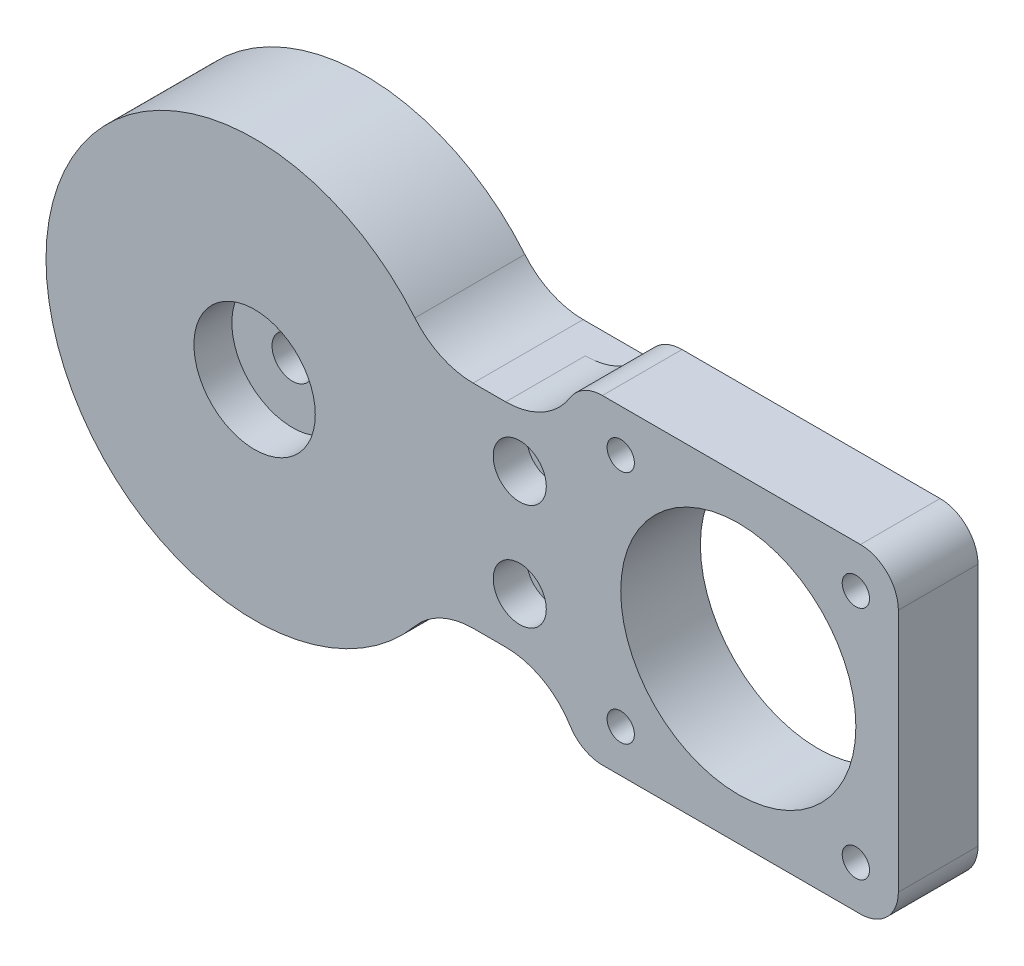
ISO-10303-21;
HEADER;
FILE_DESCRIPTION(('STEP AP214'),'2;1');
FILE_NAME('part.step','',(''),(''),'','','');
FILE_SCHEMA(('AUTOMOTIVE_DESIGN { 1 0 10303 214 1 1 1 1 }'));
ENDSEC;
DATA;
#1=APPLICATION_CONTEXT('core data for automotive mechanical design processes');
#2=APPLICATION_PROTOCOL_DEFINITION('international standard','automotive_design',2000,#1);
#3=PRODUCT_CONTEXT('',#1,'mechanical');
#4=PRODUCT('Part','Part','',(#3));
#5=PRODUCT_RELATED_PRODUCT_CATEGORY('part','',(#4));
#6=PRODUCT_DEFINITION_FORMATION('','',#4);
#7=PRODUCT_DEFINITION_CONTEXT('part definition',#1,'design');
#8=PRODUCT_DEFINITION('design','',#6,#7);
#9=PRODUCT_DEFINITION_SHAPE('','',#8);
#10=(LENGTH_UNIT() NAMED_UNIT(*) SI_UNIT(.MILLI.,.METRE.));
#11=(NAMED_UNIT(*) PLANE_ANGLE_UNIT() SI_UNIT($,.RADIAN.));
#12=(NAMED_UNIT(*) SI_UNIT($,.STERADIAN.) SOLID_ANGLE_UNIT());
#13=UNCERTAINTY_MEASURE_WITH_UNIT(LENGTH_MEASURE(1.E-05),#10,'distance_accuracy_value','');
#14=(GEOMETRIC_REPRESENTATION_CONTEXT(3) GLOBAL_UNCERTAINTY_ASSIGNED_CONTEXT((#13)) GLOBAL_UNIT_ASSIGNED_CONTEXT((#10,
#11,#12)) REPRESENTATION_CONTEXT('',''));
#15=CARTESIAN_POINT('',(0.,0.,0.));
#16=DIRECTION('',(0.,0.,1.));
#17=DIRECTION('',(1.,0.,0.));
#18=AXIS2_PLACEMENT_3D('',#15,#16,#17);
#19=CARTESIAN_POINT('',(0.,0.,14.5));
#20=DIRECTION('',(0.,0.,-1.));
#21=DIRECTION('',(-1.,0.,0.));
#22=AXIS2_PLACEMENT_3D('',#19,#20,#21);
#23=CYLINDRICAL_SURFACE('',#22,2.7);
#24=CARTESIAN_POINT('',(0.,0.,0.));
#25=DIRECTION('',(0.,0.,1.));
#26=DIRECTION('',(1.,0.,0.));
#27=AXIS2_PLACEMENT_3D('',#24,#25,#26);
#28=CIRCLE('',#27,2.7);
#29=CARTESIAN_POINT('',(-2.7,0.,0.));
#30=VERTEX_POINT('',#29);
#31=EDGE_CURVE('E197',#30,#30,#28,.T.);
#32=CARTESIAN_POINT('',(0.,0.,9.5));
#33=DIRECTION('',(0.,0.,1.));
#34=DIRECTION('',(1.,0.,0.));
#35=AXIS2_PLACEMENT_3D('',#32,#33,#34);
#36=CIRCLE('',#35,2.7);
#37=CARTESIAN_POINT('',(-2.7,0.,9.5));
#38=VERTEX_POINT('',#37);
#39=EDGE_CURVE('E182',#38,#38,#36,.T.);
#40=CARTESIAN_POINT('',(-2.7,0.,0.));
#41=CARTESIAN_POINT('',(-2.7,0.,0.0989583333333334));
#42=CARTESIAN_POINT('',(-2.7,0.,0.197916666666667));
#43=CARTESIAN_POINT('',(-2.7,0.,0.395833333333334));
#44=CARTESIAN_POINT('',(-2.7,0.,0.494791666666667));
#45=CARTESIAN_POINT('',(-2.7,0.,0.692708333333334));
#46=CARTESIAN_POINT('',(-2.7,0.,0.791666666666667));
#47=CARTESIAN_POINT('',(-2.7,0.,0.989583333333334));
#48=CARTESIAN_POINT('',(-2.7,0.,1.08854166666667));
#49=CARTESIAN_POINT('',(-2.7,0.,1.28645833333333));
#50=CARTESIAN_POINT('',(-2.7,0.,1.38541666666667));
#51=CARTESIAN_POINT('',(-2.7,0.,1.58333333333333));
#52=CARTESIAN_POINT('',(-2.7,0.,1.68229166666667));
#53=CARTESIAN_POINT('',(-2.7,0.,1.88020833333333));
#54=CARTESIAN_POINT('',(-2.7,0.,1.97916666666667));
#55=CARTESIAN_POINT('',(-2.7,0.,2.17708333333333));
#56=CARTESIAN_POINT('',(-2.7,0.,2.27604166666667));
#57=CARTESIAN_POINT('',(-2.7,0.,2.47395833333333));
#58=CARTESIAN_POINT('',(-2.7,0.,2.57291666666667));
#59=CARTESIAN_POINT('',(-2.7,0.,2.77083333333333));
#60=CARTESIAN_POINT('',(-2.7,0.,2.86979166666667));
#61=CARTESIAN_POINT('',(-2.7,0.,3.06770833333333));
#62=CARTESIAN_POINT('',(-2.7,0.,3.16666666666667));
#63=CARTESIAN_POINT('',(-2.7,0.,3.36458333333333));
#64=CARTESIAN_POINT('',(-2.7,0.,3.46354166666667));
#65=CARTESIAN_POINT('',(-2.7,0.,3.66145833333333));
#66=CARTESIAN_POINT('',(-2.7,0.,3.76041666666667));
#67=CARTESIAN_POINT('',(-2.7,0.,3.95833333333333));
#68=CARTESIAN_POINT('',(-2.7,0.,4.05729166666667));
#69=CARTESIAN_POINT('',(-2.7,0.,4.25520833333333));
#70=CARTESIAN_POINT('',(-2.7,0.,4.35416666666667));
#71=CARTESIAN_POINT('',(-2.7,0.,4.55208333333333));
#72=CARTESIAN_POINT('',(-2.7,0.,4.65104166666667));
#73=CARTESIAN_POINT('',(-2.7,0.,4.84895833333333));
#74=CARTESIAN_POINT('',(-2.7,0.,4.94791666666667));
#75=CARTESIAN_POINT('',(-2.7,0.,5.14583333333333));
#76=CARTESIAN_POINT('',(-2.7,0.,5.24479166666667));
#77=CARTESIAN_POINT('',(-2.7,0.,5.44270833333333));
#78=CARTESIAN_POINT('',(-2.7,0.,5.54166666666667));
#79=CARTESIAN_POINT('',(-2.7,0.,5.73958333333333));
#80=CARTESIAN_POINT('',(-2.7,0.,5.83854166666667));
#81=CARTESIAN_POINT('',(-2.7,0.,6.03645833333333));
#82=CARTESIAN_POINT('',(-2.7,0.,6.13541666666667));
#83=CARTESIAN_POINT('',(-2.7,0.,6.33333333333333));
#84=CARTESIAN_POINT('',(-2.7,0.,6.43229166666667));
#85=CARTESIAN_POINT('',(-2.7,0.,6.63020833333333));
#86=CARTESIAN_POINT('',(-2.7,0.,6.72916666666667));
#87=CARTESIAN_POINT('',(-2.7,0.,6.92708333333333));
#88=CARTESIAN_POINT('',(-2.7,0.,7.02604166666667));
#89=CARTESIAN_POINT('',(-2.7,0.,7.22395833333333));
#90=CARTESIAN_POINT('',(-2.7,0.,7.32291666666667));
#91=CARTESIAN_POINT('',(-2.7,0.,7.52083333333333));
#92=CARTESIAN_POINT('',(-2.7,0.,7.61979166666667));
#93=CARTESIAN_POINT('',(-2.7,0.,7.81770833333333));
#94=CARTESIAN_POINT('',(-2.7,0.,7.91666666666667));
#95=CARTESIAN_POINT('',(-2.7,0.,8.11458333333333));
#96=CARTESIAN_POINT('',(-2.7,0.,8.21354166666667));
#97=CARTESIAN_POINT('',(-2.7,0.,8.41145833333333));
#98=CARTESIAN_POINT('',(-2.7,0.,8.51041666666667));
#99=CARTESIAN_POINT('',(-2.7,0.,8.70833333333333));
#100=CARTESIAN_POINT('',(-2.7,0.,8.80729166666667));
#101=CARTESIAN_POINT('',(-2.7,0.,9.00520833333333));
#102=CARTESIAN_POINT('',(-2.7,0.,9.10416666666667));
#103=CARTESIAN_POINT('',(-2.7,0.,9.30208333333333));
#104=CARTESIAN_POINT('',(-2.7,0.,9.40104166666667));
#105=CARTESIAN_POINT('',(-2.7,0.,9.5));
#106=B_SPLINE_CURVE_WITH_KNOTS('',3,(#40,#41,#42,#43,#44,#45,#46,#47,#48,#49,#50,#51,#52,#53,
#54,#55,#56,#57,#58,#59,#60,#61,#62,#63,#64,#65,#66,#67,#68,#69,#70,#71,#72,#73,#74,#75,#76,#77,
#78,#79,#80,#81,#82,#83,#84,#85,#86,#87,#88,#89,#90,#91,#92,#93,#94,#95,#96,#97,#98,#99,#100,
#101,#102,#103,#104,#105),.UNSPECIFIED.,.F.,.F.,(4,2,2,2,2,2,2,2,2,2,2,2,2,2,2,2,2,2,2,2,2,2,2,
2,2,2,2,2,2,2,2,2,4),(0.,0.296875,0.593750000000001,0.890625000000001,1.1875,1.484375,1.78125,
2.078125,2.375,2.671875,2.96875,3.265625,3.5625,3.859375,4.15625,4.453125,4.75,5.046875,5.34375,
5.640625,5.9375,6.234375,6.53125,6.828125,7.125,7.421875,7.71875,8.015625,8.3125,8.609375,
8.90625,9.203125,9.5),.UNSPECIFIED.);
#107=EDGE_CURVE('BSEAM37',#30,#38,#106,.T.);
#108=ORIENTED_EDGE('',*,*,#31,.F.);
#109=ORIENTED_EDGE('',*,*,#39,.T.);
#110=ORIENTED_EDGE('',*,*,#107,.T.);
#111=ORIENTED_EDGE('',*,*,#107,.F.);
#112=EDGE_LOOP('',(#108,#110,#109,#111));
#113=FACE_BOUND('',#112,.T.);
#114=ADVANCED_FACE('F37',(#113),#23,.F.);
#115=CARTESIAN_POINT('',(0.,0.,14.5));
#116=DIRECTION('',(0.,0.,1.));
#117=DIRECTION('',(1.,0.,0.));
#118=AXIS2_PLACEMENT_3D('',#115,#116,#117);
#119=PLANE('',#118);
#120=CARTESIAN_POINT('',(34.9566966857832,7.,14.5));
#121=DIRECTION('',(0.,0.,1.));
#122=DIRECTION('',(1.,0.,0.));
#123=AXIS2_PLACEMENT_3D('',#120,#121,#122);
#124=CIRCLE('',#123,3.5);
#125=CARTESIAN_POINT('',(38.4566966857832,7.,14.5));
#126=VERTEX_POINT('',#125);
#127=EDGE_CURVE('E347',#126,#126,#124,.T.);
#128=ORIENTED_EDGE('',*,*,#127,.F.);
#129=EDGE_LOOP('',(#128));
#130=FACE_BOUND('',#129,.T.);
#131=CARTESIAN_POINT('',(34.9566966857832,-7.,14.5));
#132=DIRECTION('',(0.,0.,1.));
#133=DIRECTION('',(1.,0.,0.));
#134=AXIS2_PLACEMENT_3D('',#131,#132,#133);
#135=CIRCLE('',#134,3.5);
#136=CARTESIAN_POINT('',(38.4566966857832,-7.,14.5));
#137=VERTEX_POINT('',#136);
#138=EDGE_CURVE('E335',#137,#137,#135,.T.);
#139=ORIENTED_EDGE('',*,*,#138,.F.);
#140=EDGE_LOOP('',(#139));
#141=FACE_BOUND('',#140,.T.);
#142=CARTESIAN_POINT('',(79.2696007570893,-15.5,14.5));
#143=DIRECTION('',(0.,0.,1.));
#144=DIRECTION('',(1.,0.,0.));
#145=AXIS2_PLACEMENT_3D('',#142,#143,#144);
#146=CIRCLE('',#145,1.8);
#147=CARTESIAN_POINT('',(81.0696007570893,-15.5,14.5));
#148=VERTEX_POINT('',#147);
#149=EDGE_CURVE('E273',#148,#148,#146,.T.);
#150=ORIENTED_EDGE('',*,*,#149,.F.);
#151=EDGE_LOOP('',(#150));
#152=FACE_BOUND('',#151,.T.);
#153=CARTESIAN_POINT('',(79.2696007570893,15.5,14.5));
#154=DIRECTION('',(0.,0.,1.));
#155=DIRECTION('',(1.,0.,0.));
#156=AXIS2_PLACEMENT_3D('',#153,#154,#155);
#157=CIRCLE('',#156,1.8);
#158=CARTESIAN_POINT('',(81.0696007570892,15.5,14.5));
#159=VERTEX_POINT('',#158);
#160=EDGE_CURVE('E269',#159,#159,#157,.T.);
#161=ORIENTED_EDGE('',*,*,#160,.F.);
#162=EDGE_LOOP('',(#161));
#163=FACE_BOUND('',#162,.T.);
#164=CARTESIAN_POINT('',(48.2696007570893,15.5,14.5));
#165=DIRECTION('',(0.,0.,1.));
#166=DIRECTION('',(1.,0.,0.));
#167=AXIS2_PLACEMENT_3D('',#164,#165,#166);
#168=CIRCLE('',#167,1.8);
#169=CARTESIAN_POINT('',(50.0696007570893,15.5,14.5));
#170=VERTEX_POINT('',#169);
#171=EDGE_CURVE('E265',#170,#170,#168,.T.);
#172=ORIENTED_EDGE('',*,*,#171,.F.);
#173=EDGE_LOOP('',(#172));
#174=FACE_BOUND('',#173,.T.);
#175=CARTESIAN_POINT('',(48.2696007570893,-15.5,14.5));
#176=DIRECTION('',(0.,0.,1.));
#177=DIRECTION('',(1.,0.,0.));
#178=AXIS2_PLACEMENT_3D('',#175,#176,#177);
#179=CIRCLE('',#178,1.8);
#180=CARTESIAN_POINT('',(50.0696007570893,-15.5,14.5));
#181=VERTEX_POINT('',#180);
#182=EDGE_CURVE('E261',#181,#181,#179,.T.);
#183=ORIENTED_EDGE('',*,*,#182,.F.);
#184=EDGE_LOOP('',(#183));
#185=FACE_BOUND('',#184,.T.);
#186=CARTESIAN_POINT('',(0.,0.,14.5));
#187=DIRECTION('',(0.,0.,1.));
#188=DIRECTION('',(1.,0.,0.));
#189=AXIS2_PLACEMENT_3D('',#186,#187,#188);
#190=CIRCLE('',#189,8.);
#191=CARTESIAN_POINT('',(8.,0.,14.5));
#192=VERTEX_POINT('',#191);
#193=EDGE_CURVE('E260',#192,#192,#190,.T.);
#194=ORIENTED_EDGE('',*,*,#193,.F.);
#195=EDGE_LOOP('',(#194));
#196=FACE_BOUND('',#195,.T.);
#197=CARTESIAN_POINT('',(33.0993343031184,-24.,14.5));
#198=DIRECTION('',(0.,0.,1.));
#199=DIRECTION('',(1.,0.,0.));
#200=AXIS2_PLACEMENT_3D('',#197,#198,#199);
#201=CIRCLE('',#200,10.);
#202=CARTESIAN_POINT('',(33.0993343031184,-14.,14.5));
#203=VERTEX_POINT('',#202);
#204=CARTESIAN_POINT('',(41.6000532269637,-18.7333333333333,14.5));
#205=VERTEX_POINT('',#204);
#206=EDGE_CURVE('E240',#203,#205,#201,.F.);
#207=ORIENTED_EDGE('',*,*,#206,.T.);
#208=CARTESIAN_POINT('',(45.8504126888864,-16.1,14.5));
#209=DIRECTION('',(0.,0.,1.));
#210=DIRECTION('',(1.,0.,0.));
#211=AXIS2_PLACEMENT_3D('',#208,#209,#210);
#212=CIRCLE('',#211,5.);
#213=CARTESIAN_POINT('',(45.8504126888864,-21.1,14.5));
#214=VERTEX_POINT('',#213);
#215=EDGE_CURVE('E293',#205,#214,#212,.T.);
#216=ORIENTED_EDGE('',*,*,#215,.T.);
#217=DIRECTION('',(1.,0.,0.));
#218=VECTOR('',#217,1.);
#219=CARTESIAN_POINT('',(42.6696007570893,-21.1,14.5));
#220=LINE('',#219,#218);
#221=CARTESIAN_POINT('',(79.8696007570892,-21.1,14.5));
#222=VERTEX_POINT('',#221);
#223=EDGE_CURVE('E213',#214,#222,#220,.T.);
#224=ORIENTED_EDGE('',*,*,#223,.T.);
#225=CARTESIAN_POINT('',(79.8696007570892,-16.1,14.5));
#226=DIRECTION('',(0.,0.,1.));
#227=DIRECTION('',(1.,0.,0.));
#228=AXIS2_PLACEMENT_3D('',#225,#226,#227);
#229=CIRCLE('',#228,5.);
#230=CARTESIAN_POINT('',(84.8696007570893,-16.1,14.5));
#231=VERTEX_POINT('',#230);
#232=EDGE_CURVE('E291',#222,#231,#229,.T.);
#233=ORIENTED_EDGE('',*,*,#232,.T.);
#234=DIRECTION('',(0.,1.,0.));
#235=VECTOR('',#234,1.);
#236=CARTESIAN_POINT('',(84.8696007570893,-21.1,14.5));
#237=LINE('',#236,#235);
#238=CARTESIAN_POINT('',(84.8696007570893,16.1,14.5));
#239=VERTEX_POINT('',#238);
#240=EDGE_CURVE('E164',#231,#239,#237,.T.);
#241=ORIENTED_EDGE('',*,*,#240,.T.);
#242=CARTESIAN_POINT('',(79.8696007570892,16.1,14.5));
#243=DIRECTION('',(0.,0.,1.));
#244=DIRECTION('',(1.,0.,0.));
#245=AXIS2_PLACEMENT_3D('',#242,#243,#244);
#246=CIRCLE('',#245,5.);
#247=CARTESIAN_POINT('',(79.8696007570892,21.1,14.5));
#248=VERTEX_POINT('',#247);
#249=EDGE_CURVE('E289',#239,#248,#246,.T.);
#250=ORIENTED_EDGE('',*,*,#249,.T.);
#251=DIRECTION('',(-1.,0.,0.));
#252=VECTOR('',#251,1.);
#253=CARTESIAN_POINT('',(42.6696007570893,21.1,14.5));
#254=LINE('',#253,#252);
#255=CARTESIAN_POINT('',(45.8504126888864,21.1,14.5));
#256=VERTEX_POINT('',#255);
#257=EDGE_CURVE('E202',#248,#256,#254,.T.);
#258=ORIENTED_EDGE('',*,*,#257,.T.);
#259=CARTESIAN_POINT('',(45.8504126888864,16.1,14.5));
#260=DIRECTION('',(0.,0.,1.));
#261=DIRECTION('',(1.,0.,0.));
#262=AXIS2_PLACEMENT_3D('',#259,#260,#261);
#263=CIRCLE('',#262,5.);
#264=CARTESIAN_POINT('',(41.6000532269637,18.7333333333333,14.5));
#265=VERTEX_POINT('',#264);
#266=EDGE_CURVE('E52',#256,#265,#263,.T.);
#267=ORIENTED_EDGE('',*,*,#266,.T.);
#268=CARTESIAN_POINT('',(33.0993343031184,24.,14.5));
#269=DIRECTION('',(0.,0.,1.));
#270=DIRECTION('',(1.,0.,0.));
#271=AXIS2_PLACEMENT_3D('',#268,#269,#270);
#272=CIRCLE('',#271,10.);
#273=CARTESIAN_POINT('',(33.0993343031184,14.,14.5));
#274=VERTEX_POINT('',#273);
#275=EDGE_CURVE('E246',#265,#274,#272,.F.);
#276=ORIENTED_EDGE('',*,*,#275,.T.);
#277=DIRECTION('',(-1.,0.,0.));
#278=VECTOR('',#277,1.);
#279=CARTESIAN_POINT('',(23.6696007570893,14.,14.5));
#280=LINE('',#279,#278);
#281=CARTESIAN_POINT('',(28.8140590684478,14.,14.5));
#282=VERTEX_POINT('',#281);
#283=EDGE_CURVE('E204',#274,#282,#280,.T.);
#284=ORIENTED_EDGE('',*,*,#283,.T.);
#285=CARTESIAN_POINT('',(28.8140590684478,24.,14.5));
#286=DIRECTION('',(0.,0.,1.));
#287=DIRECTION('',(1.,0.,0.));
#288=AXIS2_PLACEMENT_3D('',#285,#286,#287);
#289=CIRCLE('',#288,10.);
#290=CARTESIAN_POINT('',(21.1303099835284,17.6,14.5));
#291=VERTEX_POINT('',#290);
#292=EDGE_CURVE('E254',#282,#291,#289,.F.);
#293=ORIENTED_EDGE('',*,*,#292,.T.);
#294=CARTESIAN_POINT('',(0.,0.,14.5));
#295=DIRECTION('',(0.,0.,1.));
#296=DIRECTION('',(1.,0.,0.));
#297=AXIS2_PLACEMENT_3D('',#294,#295,#296);
#298=CIRCLE('',#297,27.5);
#299=CARTESIAN_POINT('',(21.1303099835284,-17.6,14.5));
#300=VERTEX_POINT('',#299);
#301=EDGE_CURVE('E207',#291,#300,#298,.T.);
#302=ORIENTED_EDGE('',*,*,#301,.T.);
#303=CARTESIAN_POINT('',(28.8140590684478,-24.,14.5));
#304=DIRECTION('',(0.,0.,1.));
#305=DIRECTION('',(1.,0.,0.));
#306=AXIS2_PLACEMENT_3D('',#303,#304,#305);
#307=CIRCLE('',#306,10.);
#308=CARTESIAN_POINT('',(28.8140590684478,-14.,14.5));
#309=VERTEX_POINT('',#308);
#310=EDGE_CURVE('E250',#300,#309,#307,.F.);
#311=ORIENTED_EDGE('',*,*,#310,.T.);
#312=DIRECTION('',(1.,0.,0.));
#313=VECTOR('',#312,1.);
#314=CARTESIAN_POINT('',(23.6696007570893,-14.,14.5));
#315=LINE('',#314,#313);
#316=EDGE_CURVE('E210',#309,#203,#315,.T.);
#317=ORIENTED_EDGE('',*,*,#316,.T.);
#318=EDGE_LOOP('',(#207,#216,#224,#233,#241,#250,#258,#267,#276,#284,#293,#302,#311,#317));
#319=FACE_BOUND('',#318,.T.);
#320=CARTESIAN_POINT('',(63.7696007570893,0.,14.5));
#321=DIRECTION('',(0.,0.,1.));
#322=DIRECTION('',(1.,0.,0.));
#323=AXIS2_PLACEMENT_3D('',#320,#321,#322);
#324=CIRCLE('',#323,15.5);
#325=CARTESIAN_POINT('',(48.2696007570893,0.,14.5));
#326=VERTEX_POINT('',#325);
#327=EDGE_CURVE('E194',#326,#326,#324,.T.);
#328=ORIENTED_EDGE('',*,*,#327,.F.);
#329=EDGE_LOOP('',(#328));
#330=FACE_BOUND('',#329,.T.);
#331=ADVANCED_FACE('F353',(#130,#141,#152,#163,#174,#185,#196,#319,#330),#119,.T.);
#332=CARTESIAN_POINT('',(0.,0.,0.));
#333=DIRECTION('',(0.,0.,1.));
#334=DIRECTION('',(1.,0.,0.));
#335=AXIS2_PLACEMENT_3D('',#332,#333,#334);
#336=PLANE('',#335);
#337=CARTESIAN_POINT('',(34.9566966857832,7.,0.));
#338=DIRECTION('',(0.,0.,1.));
#339=DIRECTION('',(1.,0.,0.));
#340=AXIS2_PLACEMENT_3D('',#337,#338,#339);
#341=CIRCLE('',#340,1.8);
#342=CARTESIAN_POINT('',(36.7566966857832,7.,0.));
#343=VERTEX_POINT('',#342);
#344=EDGE_CURVE('E338',#343,#343,#341,.T.);
#345=ORIENTED_EDGE('',*,*,#344,.T.);
#346=EDGE_LOOP('',(#345));
#347=FACE_BOUND('',#346,.T.);
#348=CARTESIAN_POINT('',(34.9566966857832,-7.,0.));
#349=DIRECTION('',(0.,0.,1.));
#350=DIRECTION('',(1.,0.,0.));
#351=AXIS2_PLACEMENT_3D('',#348,#349,#350);
#352=CIRCLE('',#351,1.8);
#353=CARTESIAN_POINT('',(36.7566966857832,-7.,0.));
#354=VERTEX_POINT('',#353);
#355=EDGE_CURVE('E326',#354,#354,#352,.T.);
#356=ORIENTED_EDGE('',*,*,#355,.T.);
#357=EDGE_LOOP('',(#356));
#358=FACE_BOUND('',#357,.T.);
#359=DIRECTION('',(-1.,0.,0.));
#360=VECTOR('',#359,1.);
#361=CARTESIAN_POINT('',(23.6696007570893,14.,0.));
#362=LINE('',#361,#360);
#363=CARTESIAN_POINT('',(42.6696007570893,14.,0.));
#364=VERTEX_POINT('',#363);
#365=CARTESIAN_POINT('',(28.8140590684478,14.,0.));
#366=VERTEX_POINT('',#365);
#367=EDGE_CURVE('E181',#364,#366,#362,.T.);
#368=ORIENTED_EDGE('',*,*,#367,.F.);
#369=DIRECTION('',(0.,1.,0.));
#370=VECTOR('',#369,1.);
#371=CARTESIAN_POINT('',(42.6696007570893,-21.1,0.));
#372=LINE('',#371,#370);
#373=CARTESIAN_POINT('',(42.6696007570893,-14.,0.));
#374=VERTEX_POINT('',#373);
#375=EDGE_CURVE('E170',#374,#364,#372,.T.);
#376=ORIENTED_EDGE('',*,*,#375,.F.);
#377=DIRECTION('',(1.,0.,0.));
#378=VECTOR('',#377,1.);
#379=CARTESIAN_POINT('',(23.6696007570893,-14.,0.));
#380=LINE('',#379,#378);
#381=CARTESIAN_POINT('',(28.8140590684478,-14.,0.));
#382=VERTEX_POINT('',#381);
#383=EDGE_CURVE('E153',#382,#374,#380,.T.);
#384=ORIENTED_EDGE('',*,*,#383,.F.);
#385=CARTESIAN_POINT('',(28.8140590684478,-24.,0.));
#386=DIRECTION('',(0.,0.,1.));
#387=DIRECTION('',(1.,0.,0.));
#388=AXIS2_PLACEMENT_3D('',#385,#386,#387);
#389=CIRCLE('',#388,10.);
#390=CARTESIAN_POINT('',(21.1303099835284,-17.6,0.));
#391=VERTEX_POINT('',#390);
#392=EDGE_CURVE('E248',#382,#391,#389,.T.);
#393=ORIENTED_EDGE('',*,*,#392,.T.);
#394=CARTESIAN_POINT('',(0.,0.,0.));
#395=DIRECTION('',(0.,0.,1.));
#396=DIRECTION('',(1.,0.,0.));
#397=AXIS2_PLACEMENT_3D('',#394,#395,#396);
#398=CIRCLE('',#397,27.5);
#399=CARTESIAN_POINT('',(21.1303099835284,17.6,0.));
#400=VERTEX_POINT('',#399);
#401=EDGE_CURVE('E165',#400,#391,#398,.T.);
#402=ORIENTED_EDGE('',*,*,#401,.F.);
#403=CARTESIAN_POINT('',(28.8140590684478,24.,0.));
#404=DIRECTION('',(0.,0.,1.));
#405=DIRECTION('',(1.,0.,0.));
#406=AXIS2_PLACEMENT_3D('',#403,#404,#405);
#407=CIRCLE('',#406,10.);
#408=EDGE_CURVE('E252',#400,#366,#407,.T.);
#409=ORIENTED_EDGE('',*,*,#408,.T.);
#410=EDGE_LOOP('',(#368,#376,#384,#393,#402,#409));
#411=FACE_BOUND('',#410,.T.);
#412=ORIENTED_EDGE('',*,*,#31,.T.);
#413=EDGE_LOOP('',(#412));
#414=FACE_BOUND('',#413,.T.);
#415=ADVANCED_FACE('F178',(#347,#358,#411,#414),#336,.F.);
#416=CARTESIAN_POINT('',(84.8696007570893,-21.1,14.5));
#417=DIRECTION('',(-1.,0.,0.));
#418=DIRECTION('',(0.,0.,1.));
#419=AXIS2_PLACEMENT_3D('',#416,#417,#418);
#420=PLANE('',#419);
#421=ORIENTED_EDGE('',*,*,#240,.F.);
#422=DIRECTION('',(0.,0.,-1.));
#423=VECTOR('',#422,1.);
#424=CARTESIAN_POINT('',(84.8696007570893,-16.1,14.5));
#425=LINE('',#424,#423);
#426=CARTESIAN_POINT('',(84.8696007570892,-16.1,4.));
#427=VERTEX_POINT('',#426);
#428=EDGE_CURVE('E297',#231,#427,#425,.T.);
#429=ORIENTED_EDGE('',*,*,#428,.T.);
#430=DIRECTION('',(0.,-1.,0.));
#431=VECTOR('',#430,1.);
#432=CARTESIAN_POINT('',(84.8696007570892,-21.1,4.));
#433=LINE('',#432,#431);
#434=CARTESIAN_POINT('',(84.8696007570892,16.1,4.));
#435=VERTEX_POINT('',#434);
#436=EDGE_CURVE('E311',#435,#427,#433,.T.);
#437=ORIENTED_EDGE('',*,*,#436,.F.);
#438=DIRECTION('',(0.,0.,-1.));
#439=VECTOR('',#438,1.);
#440=CARTESIAN_POINT('',(84.8696007570893,16.1,14.5));
#441=LINE('',#440,#439);
#442=EDGE_CURVE('E295',#435,#239,#441,.F.);
#443=ORIENTED_EDGE('',*,*,#442,.T.);
#444=EDGE_LOOP('',(#421,#429,#437,#443));
#445=FACE_BOUND('',#444,.T.);
#446=ADVANCED_FACE('F395',(#445),#420,.F.);
#447=CARTESIAN_POINT('',(42.6696007570893,21.1,14.5));
#448=DIRECTION('',(0.,-1.,0.));
#449=DIRECTION('',(0.,0.,-1.));
#450=AXIS2_PLACEMENT_3D('',#447,#448,#449);
#451=PLANE('',#450);
#452=ORIENTED_EDGE('',*,*,#257,.F.);
#453=DIRECTION('',(0.,0.,-1.));
#454=VECTOR('',#453,1.);
#455=CARTESIAN_POINT('',(79.8696007570892,21.1,14.5));
#456=LINE('',#455,#454);
#457=CARTESIAN_POINT('',(79.8696007570892,21.1,4.));
#458=VERTEX_POINT('',#457);
#459=EDGE_CURVE('E45',#248,#458,#456,.T.);
#460=ORIENTED_EDGE('',*,*,#459,.T.);
#461=DIRECTION('',(1.,0.,0.));
#462=VECTOR('',#461,1.);
#463=CARTESIAN_POINT('',(84.8696007570892,21.1,4.));
#464=LINE('',#463,#462);
#465=CARTESIAN_POINT('',(45.8504126888864,21.1,4.));
#466=VERTEX_POINT('',#465);
#467=EDGE_CURVE('E184',#466,#458,#464,.T.);
#468=ORIENTED_EDGE('',*,*,#467,.F.);
#469=DIRECTION('',(0.,0.,-1.));
#470=VECTOR('',#469,1.);
#471=CARTESIAN_POINT('',(45.8504126888864,21.1,14.5));
#472=LINE('',#471,#470);
#473=EDGE_CURVE('E60',#466,#256,#472,.F.);
#474=ORIENTED_EDGE('',*,*,#473,.T.);
#475=EDGE_LOOP('',(#452,#460,#468,#474));
#476=FACE_BOUND('',#475,.T.);
#477=ADVANCED_FACE('F303',(#476),#451,.F.);
#478=CARTESIAN_POINT('',(23.6696007570893,14.,14.5));
#479=DIRECTION('',(0.,-1.,0.));
#480=DIRECTION('',(0.,0.,-1.));
#481=AXIS2_PLACEMENT_3D('',#478,#479,#480);
#482=PLANE('',#481);
#483=ORIENTED_EDGE('',*,*,#283,.F.);
#484=DIRECTION('',(0.,0.,-1.));
#485=VECTOR('',#484,1.);
#486=CARTESIAN_POINT('',(33.0993343031184,14.,14.5));
#487=LINE('',#486,#485);
#488=CARTESIAN_POINT('',(33.0993343031184,14.,4.));
#489=VERTEX_POINT('',#488);
#490=EDGE_CURVE('E230',#274,#489,#487,.T.);
#491=ORIENTED_EDGE('',*,*,#490,.T.);
#492=DIRECTION('',(1.,0.,0.));
#493=VECTOR('',#492,1.);
#494=CARTESIAN_POINT('',(0.,14.,4.));
#495=LINE('',#494,#493);
#496=CARTESIAN_POINT('',(42.6696007570893,14.,4.));
#497=VERTEX_POINT('',#496);
#498=EDGE_CURVE('E228',#489,#497,#495,.T.);
#499=ORIENTED_EDGE('',*,*,#498,.T.);
#500=DIRECTION('',(0.,0.,-1.));
#501=VECTOR('',#500,1.);
#502=CARTESIAN_POINT('',(42.6696007570893,14.,14.5));
#503=LINE('',#502,#501);
#504=EDGE_CURVE('E174',#497,#364,#503,.T.);
#505=ORIENTED_EDGE('',*,*,#504,.T.);
#506=ORIENTED_EDGE('',*,*,#367,.T.);
#507=DIRECTION('',(0.,0.,1.));
#508=VECTOR('',#507,1.);
#509=CARTESIAN_POINT('',(28.8140590684478,14.,14.5));
#510=LINE('',#509,#508);
#511=EDGE_CURVE('E226',#366,#282,#510,.T.);
#512=ORIENTED_EDGE('',*,*,#511,.T.);
#513=EDGE_LOOP('',(#483,#491,#499,#505,#506,#512));
#514=FACE_BOUND('',#513,.T.);
#515=ADVANCED_FACE('F403',(#514),#482,.F.);
#516=CARTESIAN_POINT('',(0.,0.,14.5));
#517=DIRECTION('',(0.,0.,-1.));
#518=DIRECTION('',(-1.,0.,0.));
#519=AXIS2_PLACEMENT_3D('',#516,#517,#518);
#520=CYLINDRICAL_SURFACE('',#519,27.5);
#521=ORIENTED_EDGE('',*,*,#401,.T.);
#522=DIRECTION('',(0.,0.,-1.));
#523=VECTOR('',#522,1.);
#524=CARTESIAN_POINT('',(21.1303099835284,-17.6,14.5));
#525=LINE('',#524,#523);
#526=EDGE_CURVE('E236',#391,#300,#525,.F.);
#527=ORIENTED_EDGE('',*,*,#526,.T.);
#528=ORIENTED_EDGE('',*,*,#301,.F.);
#529=DIRECTION('',(0.,0.,-1.));
#530=VECTOR('',#529,1.);
#531=CARTESIAN_POINT('',(21.1303099835284,17.6,14.5));
#532=LINE('',#531,#530);
#533=EDGE_CURVE('E233',#291,#400,#532,.T.);
#534=ORIENTED_EDGE('',*,*,#533,.T.);
#535=EDGE_LOOP('',(#521,#527,#528,#534));
#536=FACE_BOUND('',#535,.T.);
#537=ADVANCED_FACE('F400',(#536),#520,.T.);
#538=CARTESIAN_POINT('',(23.6696007570893,-14.,14.5));
#539=DIRECTION('',(0.,1.,0.));
#540=DIRECTION('',(0.,0.,1.));
#541=AXIS2_PLACEMENT_3D('',#538,#539,#540);
#542=PLANE('',#541);
#543=DIRECTION('',(0.,0.,1.));
#544=VECTOR('',#543,1.);
#545=CARTESIAN_POINT('',(42.6696007570893,-14.,14.5));
#546=LINE('',#545,#544);
#547=CARTESIAN_POINT('',(42.6696007570893,-14.,4.));
#548=VERTEX_POINT('',#547);
#549=EDGE_CURVE('E157',#374,#548,#546,.T.);
#550=ORIENTED_EDGE('',*,*,#549,.T.);
#551=DIRECTION('',(-1.,0.,0.));
#552=VECTOR('',#551,1.);
#553=CARTESIAN_POINT('',(0.,-14.,4.));
#554=LINE('',#553,#552);
#555=CARTESIAN_POINT('',(33.0993343031184,-14.,4.));
#556=VERTEX_POINT('',#555);
#557=EDGE_CURVE('E224',#548,#556,#554,.T.);
#558=ORIENTED_EDGE('',*,*,#557,.T.);
#559=DIRECTION('',(0.,0.,1.));
#560=VECTOR('',#559,1.);
#561=CARTESIAN_POINT('',(33.0993343031184,-14.,14.5));
#562=LINE('',#561,#560);
#563=EDGE_CURVE('E222',#556,#203,#562,.T.);
#564=ORIENTED_EDGE('',*,*,#563,.T.);
#565=ORIENTED_EDGE('',*,*,#316,.F.);
#566=DIRECTION('',(0.,0.,1.));
#567=VECTOR('',#566,1.);
#568=CARTESIAN_POINT('',(28.8140590684478,-14.,0.));
#569=LINE('',#568,#567);
#570=EDGE_CURVE('E161',#309,#382,#569,.F.);
#571=ORIENTED_EDGE('',*,*,#570,.T.);
#572=ORIENTED_EDGE('',*,*,#383,.T.);
#573=EDGE_LOOP('',(#550,#558,#564,#565,#571,#572));
#574=FACE_BOUND('',#573,.T.);
#575=ADVANCED_FACE('F155',(#574),#542,.F.);
#576=CARTESIAN_POINT('',(42.6696007570893,-21.1,14.5));
#577=DIRECTION('',(0.,1.,0.));
#578=DIRECTION('',(0.,0.,1.));
#579=AXIS2_PLACEMENT_3D('',#576,#577,#578);
#580=PLANE('',#579);
#581=ORIENTED_EDGE('',*,*,#223,.F.);
#582=DIRECTION('',(0.,0.,1.));
#583=VECTOR('',#582,1.);
#584=CARTESIAN_POINT('',(45.8504126888864,-21.1,14.5));
#585=LINE('',#584,#583);
#586=CARTESIAN_POINT('',(45.8504126888864,-21.1,4.));
#587=VERTEX_POINT('',#586);
#588=EDGE_CURVE('E275',#214,#587,#585,.F.);
#589=ORIENTED_EDGE('',*,*,#588,.T.);
#590=DIRECTION('',(-1.,0.,0.));
#591=VECTOR('',#590,1.);
#592=CARTESIAN_POINT('',(84.8696007570892,-21.1,4.));
#593=LINE('',#592,#591);
#594=CARTESIAN_POINT('',(79.8696007570892,-21.1,4.));
#595=VERTEX_POINT('',#594);
#596=EDGE_CURVE('E190',#595,#587,#593,.T.);
#597=ORIENTED_EDGE('',*,*,#596,.F.);
#598=DIRECTION('',(0.,0.,-1.));
#599=VECTOR('',#598,1.);
#600=CARTESIAN_POINT('',(79.8696007570892,-21.1,14.5));
#601=LINE('',#600,#599);
#602=EDGE_CURVE('E256',#595,#222,#601,.F.);
#603=ORIENTED_EDGE('',*,*,#602,.T.);
#604=EDGE_LOOP('',(#581,#589,#597,#603));
#605=FACE_BOUND('',#604,.T.);
#606=ADVANCED_FACE('F375',(#605),#580,.F.);
#607=CARTESIAN_POINT('',(63.7696007570893,0.,14.5));
#608=DIRECTION('',(0.,0.,-1.));
#609=DIRECTION('',(-1.,0.,0.));
#610=AXIS2_PLACEMENT_3D('',#607,#608,#609);
#611=CYLINDRICAL_SURFACE('',#610,15.5);
#612=CARTESIAN_POINT('',(63.7696007570893,0.,4.));
#613=DIRECTION('',(0.,0.,1.));
#614=DIRECTION('',(1.,0.,0.));
#615=AXIS2_PLACEMENT_3D('',#612,#613,#614);
#616=CIRCLE('',#615,15.5);
#617=CARTESIAN_POINT('',(48.2696007570893,0.,4.));
#618=VERTEX_POINT('',#617);
#619=EDGE_CURVE('E175',#618,#618,#616,.T.);
#620=CARTESIAN_POINT('',(48.2696007570893,0.,4.));
#621=CARTESIAN_POINT('',(48.2696007570893,0.,4.109375));
#622=CARTESIAN_POINT('',(48.2696007570893,0.,4.21875));
#623=CARTESIAN_POINT('',(48.2696007570893,0.,4.4375));
#624=CARTESIAN_POINT('',(48.2696007570893,0.,4.546875));
#625=CARTESIAN_POINT('',(48.2696007570893,0.,4.765625));
#626=CARTESIAN_POINT('',(48.2696007570893,0.,4.875));
#627=CARTESIAN_POINT('',(48.2696007570893,0.,5.09375));
#628=CARTESIAN_POINT('',(48.2696007570893,0.,5.203125));
#629=CARTESIAN_POINT('',(48.2696007570893,0.,5.421875));
#630=CARTESIAN_POINT('',(48.2696007570893,0.,5.53125));
#631=CARTESIAN_POINT('',(48.2696007570893,0.,5.75));
#632=CARTESIAN_POINT('',(48.2696007570893,0.,5.859375));
#633=CARTESIAN_POINT('',(48.2696007570893,0.,6.078125));
#634=CARTESIAN_POINT('',(48.2696007570893,0.,6.1875));
#635=CARTESIAN_POINT('',(48.2696007570893,0.,6.40625));
#636=CARTESIAN_POINT('',(48.2696007570893,0.,6.515625));
#637=CARTESIAN_POINT('',(48.2696007570893,0.,6.734375));
#638=CARTESIAN_POINT('',(48.2696007570893,0.,6.84375));
#639=CARTESIAN_POINT('',(48.2696007570893,0.,7.0625));
#640=CARTESIAN_POINT('',(48.2696007570893,0.,7.171875));
#641=CARTESIAN_POINT('',(48.2696007570893,0.,7.390625));
#642=CARTESIAN_POINT('',(48.2696007570893,0.,7.5));
#643=CARTESIAN_POINT('',(48.2696007570893,0.,7.71875));
#644=CARTESIAN_POINT('',(48.2696007570893,0.,7.828125));
#645=CARTESIAN_POINT('',(48.2696007570893,0.,8.046875));
#646=CARTESIAN_POINT('',(48.2696007570893,0.,8.15625));
#647=CARTESIAN_POINT('',(48.2696007570893,0.,8.375));
#648=CARTESIAN_POINT('',(48.2696007570893,0.,8.484375));
#649=CARTESIAN_POINT('',(48.2696007570893,0.,8.703125));
#650=CARTESIAN_POINT('',(48.2696007570893,0.,8.8125));
#651=CARTESIAN_POINT('',(48.2696007570893,0.,9.03125));
#652=CARTESIAN_POINT('',(48.2696007570893,0.,9.140625));
#653=CARTESIAN_POINT('',(48.2696007570893,0.,9.359375));
#654=CARTESIAN_POINT('',(48.2696007570893,0.,9.46875));
#655=CARTESIAN_POINT('',(48.2696007570893,0.,9.6875));
#656=CARTESIAN_POINT('',(48.2696007570893,0.,9.796875));
#657=CARTESIAN_POINT('',(48.2696007570893,0.,10.015625));
#658=CARTESIAN_POINT('',(48.2696007570893,0.,10.125));
#659=CARTESIAN_POINT('',(48.2696007570893,0.,10.34375));
#660=CARTESIAN_POINT('',(48.2696007570893,0.,10.453125));
#661=CARTESIAN_POINT('',(48.2696007570893,0.,10.671875));
#662=CARTESIAN_POINT('',(48.2696007570893,0.,10.78125));
#663=CARTESIAN_POINT('',(48.2696007570893,0.,11.));
#664=CARTESIAN_POINT('',(48.2696007570893,0.,11.109375));
#665=CARTESIAN_POINT('',(48.2696007570893,0.,11.328125));
#666=CARTESIAN_POINT('',(48.2696007570893,0.,11.4375));
#667=CARTESIAN_POINT('',(48.2696007570893,0.,11.65625));
#668=CARTESIAN_POINT('',(48.2696007570893,0.,11.765625));
#669=CARTESIAN_POINT('',(48.2696007570893,0.,11.984375));
#670=CARTESIAN_POINT('',(48.2696007570893,0.,12.09375));
#671=CARTESIAN_POINT('',(48.2696007570893,0.,12.3125));
#672=CARTESIAN_POINT('',(48.2696007570893,0.,12.421875));
#673=CARTESIAN_POINT('',(48.2696007570893,0.,12.640625));
#674=CARTESIAN_POINT('',(48.2696007570893,0.,12.75));
#675=CARTESIAN_POINT('',(48.2696007570893,0.,12.96875));
#676=CARTESIAN_POINT('',(48.2696007570893,0.,13.078125));
#677=CARTESIAN_POINT('',(48.2696007570893,0.,13.296875));
#678=CARTESIAN_POINT('',(48.2696007570893,0.,13.40625));
#679=CARTESIAN_POINT('',(48.2696007570893,0.,13.625));
#680=CARTESIAN_POINT('',(48.2696007570893,0.,13.734375));
#681=CARTESIAN_POINT('',(48.2696007570893,0.,13.953125));
#682=CARTESIAN_POINT('',(48.2696007570893,0.,14.0625));
#683=CARTESIAN_POINT('',(48.2696007570893,0.,14.28125));
#684=CARTESIAN_POINT('',(48.2696007570893,0.,14.390625));
#685=CARTESIAN_POINT('',(48.2696007570893,0.,14.5));
#686=B_SPLINE_CURVE_WITH_KNOTS('',3,(#620,#621,#622,#623,#624,#625,#626,#627,#628,#629,#630,
#631,#632,#633,#634,#635,#636,#637,#638,#639,#640,#641,#642,#643,#644,#645,#646,#647,#648,#649,
#650,#651,#652,#653,#654,#655,#656,#657,#658,#659,#660,#661,#662,#663,#664,#665,#666,#667,#668,
#669,#670,#671,#672,#673,#674,#675,#676,#677,#678,#679,#680,#681,#682,#683,#684,#685),
.UNSPECIFIED.,.F.,.F.,(4,2,2,2,2,2,2,2,2,2,2,2,2,2,2,2,2,2,2,2,2,2,2,2,2,2,2,2,2,2,2,2,4),(0.,
0.328125,0.656250000000001,0.984375000000001,1.3125,1.640625,1.96875,2.296875,2.625,2.953125,
3.28125,3.609375,3.9375,4.265625,4.59375,4.921875,5.25,5.578125,5.90625,6.234375,6.5625,
6.890625,7.21875,7.546875,7.875,8.203125,8.53125,8.859375,9.1875,9.515625,9.84375,10.171875,
10.5),.UNSPECIFIED.);
#687=EDGE_CURVE('BSEAM373',#618,#326,#686,.T.);
#688=ORIENTED_EDGE('',*,*,#619,.F.);
#689=ORIENTED_EDGE('',*,*,#327,.T.);
#690=ORIENTED_EDGE('',*,*,#687,.T.);
#691=ORIENTED_EDGE('',*,*,#687,.F.);
#692=EDGE_LOOP('',(#688,#690,#689,#691));
#693=FACE_BOUND('',#692,.T.);
#694=ADVANCED_FACE('F373',(#693),#611,.F.);
#695=CARTESIAN_POINT('',(42.6696007570893,-21.1,4.));
#696=DIRECTION('',(-1.,0.,0.));
#697=DIRECTION('',(0.,0.,1.));
#698=AXIS2_PLACEMENT_3D('',#695,#696,#697);
#699=PLANE('',#698);
#700=DIRECTION('',(0.,1.,0.));
#701=VECTOR('',#700,1.);
#702=CARTESIAN_POINT('',(42.6696007570893,-21.1,4.));
#703=LINE('',#702,#701);
#704=EDGE_CURVE('E173',#548,#497,#703,.T.);
#705=ORIENTED_EDGE('',*,*,#704,.F.);
#706=ORIENTED_EDGE('',*,*,#549,.F.);
#707=ORIENTED_EDGE('',*,*,#375,.T.);
#708=ORIENTED_EDGE('',*,*,#504,.F.);
#709=EDGE_LOOP('',(#705,#706,#707,#708));
#710=FACE_BOUND('',#709,.T.);
#711=ADVANCED_FACE('F168',(#710),#699,.F.);
#712=CARTESIAN_POINT('',(0.,0.,4.));
#713=DIRECTION('',(0.,0.,1.));
#714=DIRECTION('',(1.,0.,0.));
#715=AXIS2_PLACEMENT_3D('',#712,#713,#714);
#716=PLANE('',#715);
#717=CARTESIAN_POINT('',(79.2696007570893,-15.5,4.));
#718=DIRECTION('',(0.,0.,1.));
#719=DIRECTION('',(1.,0.,0.));
#720=AXIS2_PLACEMENT_3D('',#717,#718,#719);
#721=CIRCLE('',#720,1.8);
#722=CARTESIAN_POINT('',(81.0696007570893,-15.5,4.));
#723=VERTEX_POINT('',#722);
#724=EDGE_CURVE('E270',#723,#723,#721,.T.);
#725=ORIENTED_EDGE('',*,*,#724,.T.);
#726=EDGE_LOOP('',(#725));
#727=FACE_BOUND('',#726,.T.);
#728=CARTESIAN_POINT('',(79.2696007570893,15.5,4.));
#729=DIRECTION('',(0.,0.,1.));
#730=DIRECTION('',(1.,0.,0.));
#731=AXIS2_PLACEMENT_3D('',#728,#729,#730);
#732=CIRCLE('',#731,1.8);
#733=CARTESIAN_POINT('',(81.0696007570892,15.5,4.));
#734=VERTEX_POINT('',#733);
#735=EDGE_CURVE('E266',#734,#734,#732,.T.);
#736=ORIENTED_EDGE('',*,*,#735,.T.);
#737=EDGE_LOOP('',(#736));
#738=FACE_BOUND('',#737,.T.);
#739=CARTESIAN_POINT('',(48.2696007570893,15.5,4.));
#740=DIRECTION('',(0.,0.,1.));
#741=DIRECTION('',(1.,0.,0.));
#742=AXIS2_PLACEMENT_3D('',#739,#740,#741);
#743=CIRCLE('',#742,1.8);
#744=CARTESIAN_POINT('',(50.0696007570893,15.5,4.));
#745=VERTEX_POINT('',#744);
#746=EDGE_CURVE('E262',#745,#745,#743,.T.);
#747=ORIENTED_EDGE('',*,*,#746,.T.);
#748=EDGE_LOOP('',(#747));
#749=FACE_BOUND('',#748,.T.);
#750=CARTESIAN_POINT('',(48.2696007570893,-15.5,4.));
#751=DIRECTION('',(0.,0.,1.));
#752=DIRECTION('',(1.,0.,0.));
#753=AXIS2_PLACEMENT_3D('',#750,#751,#752);
#754=CIRCLE('',#753,1.8);
#755=CARTESIAN_POINT('',(50.0696007570893,-15.5,4.));
#756=VERTEX_POINT('',#755);
#757=EDGE_CURVE('E257',#756,#756,#754,.T.);
#758=ORIENTED_EDGE('',*,*,#757,.T.);
#759=EDGE_LOOP('',(#758));
#760=FACE_BOUND('',#759,.T.);
#761=ORIENTED_EDGE('',*,*,#619,.T.);
#762=EDGE_LOOP('',(#761));
#763=FACE_BOUND('',#762,.T.);
#764=ORIENTED_EDGE('',*,*,#596,.T.);
#765=CARTESIAN_POINT('',(45.8504126888864,-16.1,4.));
#766=DIRECTION('',(0.,0.,1.));
#767=DIRECTION('',(1.,0.,0.));
#768=AXIS2_PLACEMENT_3D('',#765,#766,#767);
#769=CIRCLE('',#768,5.);
#770=CARTESIAN_POINT('',(41.6000532269637,-18.7333333333333,4.));
#771=VERTEX_POINT('',#770);
#772=EDGE_CURVE('E284',#587,#771,#769,.F.);
#773=ORIENTED_EDGE('',*,*,#772,.T.);
#774=CARTESIAN_POINT('',(33.0993343031184,-24.,4.));
#775=DIRECTION('',(0.,0.,1.));
#776=DIRECTION('',(1.,0.,0.));
#777=AXIS2_PLACEMENT_3D('',#774,#775,#776);
#778=CIRCLE('',#777,10.);
#779=EDGE_CURVE('E238',#771,#556,#778,.T.);
#780=ORIENTED_EDGE('',*,*,#779,.T.);
#781=ORIENTED_EDGE('',*,*,#557,.F.);
#782=ORIENTED_EDGE('',*,*,#704,.T.);
#783=ORIENTED_EDGE('',*,*,#498,.F.);
#784=CARTESIAN_POINT('',(33.0993343031184,24.,4.));
#785=DIRECTION('',(0.,0.,1.));
#786=DIRECTION('',(1.,0.,0.));
#787=AXIS2_PLACEMENT_3D('',#784,#785,#786);
#788=CIRCLE('',#787,10.);
#789=CARTESIAN_POINT('',(41.6000532269637,18.7333333333333,4.));
#790=VERTEX_POINT('',#789);
#791=EDGE_CURVE('E243',#489,#790,#788,.T.);
#792=ORIENTED_EDGE('',*,*,#791,.T.);
#793=CARTESIAN_POINT('',(45.8504126888864,16.1,4.));
#794=DIRECTION('',(0.,0.,1.));
#795=DIRECTION('',(1.,0.,0.));
#796=AXIS2_PLACEMENT_3D('',#793,#794,#795);
#797=CIRCLE('',#796,5.);
#798=EDGE_CURVE('E278',#790,#466,#797,.F.);
#799=ORIENTED_EDGE('',*,*,#798,.T.);
#800=ORIENTED_EDGE('',*,*,#467,.T.);
#801=CARTESIAN_POINT('',(79.8696007570892,16.1,4.));
#802=DIRECTION('',(0.,0.,1.));
#803=DIRECTION('',(1.,0.,0.));
#804=AXIS2_PLACEMENT_3D('',#801,#802,#803);
#805=CIRCLE('',#804,5.);
#806=EDGE_CURVE('E280',#458,#435,#805,.F.);
#807=ORIENTED_EDGE('',*,*,#806,.T.);
#808=ORIENTED_EDGE('',*,*,#436,.T.);
#809=CARTESIAN_POINT('',(79.8696007570892,-16.1,4.));
#810=DIRECTION('',(0.,0.,1.));
#811=DIRECTION('',(1.,0.,0.));
#812=AXIS2_PLACEMENT_3D('',#809,#810,#811);
#813=CIRCLE('',#812,5.);
#814=EDGE_CURVE('E282',#427,#595,#813,.F.);
#815=ORIENTED_EDGE('',*,*,#814,.T.);
#816=EDGE_LOOP('',(#764,#773,#780,#781,#782,#783,#792,#799,#800,#807,#808,#815));
#817=FACE_BOUND('',#816,.T.);
#818=ADVANCED_FACE('F308',(#727,#738,#749,#760,#763,#817),#716,.F.);
#819=CARTESIAN_POINT('',(0.,0.,9.5));
#820=DIRECTION('',(0.,0.,1.));
#821=DIRECTION('',(1.,0.,0.));
#822=AXIS2_PLACEMENT_3D('',#819,#820,#821);
#823=CYLINDRICAL_SURFACE('',#822,8.);
#824=CARTESIAN_POINT('',(0.,0.,9.5));
#825=DIRECTION('',(0.,0.,1.));
#826=DIRECTION('',(1.,0.,0.));
#827=AXIS2_PLACEMENT_3D('',#824,#825,#826);
#828=CIRCLE('',#827,8.);
#829=CARTESIAN_POINT('',(8.,0.,9.5));
#830=VERTEX_POINT('',#829);
#831=EDGE_CURVE('E187',#830,#830,#828,.T.);
#832=ORIENTED_EDGE('',*,*,#831,.F.);
#833=EDGE_LOOP('',(#832));
#834=FACE_BOUND('',#833,.T.);
#835=ORIENTED_EDGE('',*,*,#193,.T.);
#836=EDGE_LOOP('',(#835));
#837=FACE_BOUND('',#836,.T.);
#838=ADVANCED_FACE('F516',(#834,#837),#823,.F.);
#839=CARTESIAN_POINT('',(0.,0.,9.5));
#840=DIRECTION('',(0.,0.,1.));
#841=DIRECTION('',(1.,0.,0.));
#842=AXIS2_PLACEMENT_3D('',#839,#840,#841);
#843=PLANE('',#842);
#844=ORIENTED_EDGE('',*,*,#39,.F.);
#845=EDGE_LOOP('',(#844));
#846=FACE_BOUND('',#845,.T.);
#847=ORIENTED_EDGE('',*,*,#831,.T.);
#848=EDGE_LOOP('',(#847));
#849=FACE_BOUND('',#848,.T.);
#850=ADVANCED_FACE('F417',(#846,#849),#843,.T.);
#851=CARTESIAN_POINT('',(33.0993343031184,-24.,14.5));
#852=DIRECTION('',(0.,0.,1.));
#853=DIRECTION('',(1.,0.,0.));
#854=AXIS2_PLACEMENT_3D('',#851,#852,#853);
#855=CYLINDRICAL_SURFACE('',#854,10.);
#856=ORIENTED_EDGE('',*,*,#779,.F.);
#857=DIRECTION('',(0.,0.,1.));
#858=VECTOR('',#857,1.);
#859=CARTESIAN_POINT('',(41.6000532269637,-18.7333333333333,14.5));
#860=LINE('',#859,#858);
#861=EDGE_CURVE('E286',#771,#205,#860,.T.);
#862=ORIENTED_EDGE('',*,*,#861,.T.);
#863=ORIENTED_EDGE('',*,*,#206,.F.);
#864=ORIENTED_EDGE('',*,*,#563,.F.);
#865=EDGE_LOOP('',(#856,#862,#863,#864));
#866=FACE_BOUND('',#865,.T.);
#867=ADVANCED_FACE('F413',(#866),#855,.F.);
#868=CARTESIAN_POINT('',(33.0993343031184,24.,14.5));
#869=DIRECTION('',(0.,0.,-1.));
#870=DIRECTION('',(-1.,0.,0.));
#871=AXIS2_PLACEMENT_3D('',#868,#869,#870);
#872=CYLINDRICAL_SURFACE('',#871,10.);
#873=ORIENTED_EDGE('',*,*,#275,.F.);
#874=DIRECTION('',(0.,0.,-1.));
#875=VECTOR('',#874,1.);
#876=CARTESIAN_POINT('',(41.6000532269637,18.7333333333333,14.5));
#877=LINE('',#876,#875);
#878=EDGE_CURVE('E11',#265,#790,#877,.T.);
#879=ORIENTED_EDGE('',*,*,#878,.T.);
#880=ORIENTED_EDGE('',*,*,#791,.F.);
#881=ORIENTED_EDGE('',*,*,#490,.F.);
#882=EDGE_LOOP('',(#873,#879,#880,#881));
#883=FACE_BOUND('',#882,.T.);
#884=ADVANCED_FACE('F416',(#883),#872,.F.);
#885=CARTESIAN_POINT('',(28.8140590684478,-24.,14.5));
#886=DIRECTION('',(0.,0.,-1.));
#887=DIRECTION('',(-1.,0.,0.));
#888=AXIS2_PLACEMENT_3D('',#885,#886,#887);
#889=CYLINDRICAL_SURFACE('',#888,10.);
#890=ORIENTED_EDGE('',*,*,#310,.F.);
#891=ORIENTED_EDGE('',*,*,#526,.F.);
#892=ORIENTED_EDGE('',*,*,#392,.F.);
#893=ORIENTED_EDGE('',*,*,#570,.F.);
#894=EDGE_LOOP('',(#890,#891,#892,#893));
#895=FACE_BOUND('',#894,.T.);
#896=ADVANCED_FACE('F421',(#895),#889,.F.);
#897=CARTESIAN_POINT('',(28.8140590684478,24.,14.5));
#898=DIRECTION('',(0.,0.,-1.));
#899=DIRECTION('',(-1.,0.,0.));
#900=AXIS2_PLACEMENT_3D('',#897,#898,#899);
#901=CYLINDRICAL_SURFACE('',#900,10.);
#902=ORIENTED_EDGE('',*,*,#292,.F.);
#903=ORIENTED_EDGE('',*,*,#511,.F.);
#904=ORIENTED_EDGE('',*,*,#408,.F.);
#905=ORIENTED_EDGE('',*,*,#533,.F.);
#906=EDGE_LOOP('',(#902,#903,#904,#905));
#907=FACE_BOUND('',#906,.T.);
#908=ADVANCED_FACE('F425',(#907),#901,.F.);
#909=CARTESIAN_POINT('',(48.2696007570893,-15.5,14.5));
#910=DIRECTION('',(0.,0.,1.));
#911=DIRECTION('',(1.,0.,0.));
#912=AXIS2_PLACEMENT_3D('',#909,#910,#911);
#913=CYLINDRICAL_SURFACE('',#912,1.8);
#914=ORIENTED_EDGE('',*,*,#182,.T.);
#915=EDGE_LOOP('',(#914));
#916=FACE_BOUND('',#915,.T.);
#917=ORIENTED_EDGE('',*,*,#757,.F.);
#918=EDGE_LOOP('',(#917));
#919=FACE_BOUND('',#918,.T.);
#920=ADVANCED_FACE('F429',(#916,#919),#913,.F.);
#921=CARTESIAN_POINT('',(48.2696007570893,15.5,14.5));
#922=DIRECTION('',(0.,0.,1.));
#923=DIRECTION('',(1.,0.,0.));
#924=AXIS2_PLACEMENT_3D('',#921,#922,#923);
#925=CYLINDRICAL_SURFACE('',#924,1.8);
#926=ORIENTED_EDGE('',*,*,#171,.T.);
#927=EDGE_LOOP('',(#926));
#928=FACE_BOUND('',#927,.T.);
#929=ORIENTED_EDGE('',*,*,#746,.F.);
#930=EDGE_LOOP('',(#929));
#931=FACE_BOUND('',#930,.T.);
#932=ADVANCED_FACE('F643',(#928,#931),#925,.F.);
#933=CARTESIAN_POINT('',(79.2696007570893,15.5,14.5));
#934=DIRECTION('',(0.,0.,1.));
#935=DIRECTION('',(1.,0.,0.));
#936=AXIS2_PLACEMENT_3D('',#933,#934,#935);
#937=CYLINDRICAL_SURFACE('',#936,1.8);
#938=ORIENTED_EDGE('',*,*,#160,.T.);
#939=EDGE_LOOP('',(#938));
#940=FACE_BOUND('',#939,.T.);
#941=ORIENTED_EDGE('',*,*,#735,.F.);
#942=EDGE_LOOP('',(#941));
#943=FACE_BOUND('',#942,.T.);
#944=ADVANCED_FACE('F632',(#940,#943),#937,.F.);
#945=CARTESIAN_POINT('',(79.2696007570893,-15.5,14.5));
#946=DIRECTION('',(0.,0.,1.));
#947=DIRECTION('',(1.,0.,0.));
#948=AXIS2_PLACEMENT_3D('',#945,#946,#947);
#949=CYLINDRICAL_SURFACE('',#948,1.8);
#950=ORIENTED_EDGE('',*,*,#149,.T.);
#951=EDGE_LOOP('',(#950));
#952=FACE_BOUND('',#951,.T.);
#953=ORIENTED_EDGE('',*,*,#724,.F.);
#954=EDGE_LOOP('',(#953));
#955=FACE_BOUND('',#954,.T.);
#956=ADVANCED_FACE('F615',(#952,#955),#949,.F.);
#957=CARTESIAN_POINT('',(34.9566966857832,-7.,14.5));
#958=DIRECTION('',(0.,0.,1.));
#959=DIRECTION('',(1.,0.,0.));
#960=AXIS2_PLACEMENT_3D('',#957,#958,#959);
#961=CYLINDRICAL_SURFACE('',#960,1.8);
#962=ORIENTED_EDGE('',*,*,#355,.F.);
#963=EDGE_LOOP('',(#962));
#964=FACE_BOUND('',#963,.T.);
#965=CARTESIAN_POINT('',(34.9566966857832,-7.,10.1));
#966=DIRECTION('',(0.,0.,1.));
#967=DIRECTION('',(1.,0.,0.));
#968=AXIS2_PLACEMENT_3D('',#965,#966,#967);
#969=CIRCLE('',#968,1.8);
#970=CARTESIAN_POINT('',(36.7566966857832,-7.,10.1));
#971=VERTEX_POINT('',#970);
#972=EDGE_CURVE('E329',#971,#971,#969,.T.);
#973=ORIENTED_EDGE('',*,*,#972,.T.);
#974=EDGE_LOOP('',(#973));
#975=FACE_BOUND('',#974,.T.);
#976=ADVANCED_FACE('F604',(#964,#975),#961,.F.);
#977=CARTESIAN_POINT('',(36.7566966857832,-7.,10.1));
#978=DIRECTION('',(0.,0.,-1.));
#979=DIRECTION('',(-1.,0.,0.));
#980=AXIS2_PLACEMENT_3D('',#977,#978,#979);
#981=PLANE('',#980);
#982=ORIENTED_EDGE('',*,*,#972,.F.);
#983=EDGE_LOOP('',(#982));
#984=FACE_BOUND('',#983,.T.);
#985=CARTESIAN_POINT('',(34.9566966857832,-7.,10.1));
#986=DIRECTION('',(0.,0.,1.));
#987=DIRECTION('',(1.,0.,0.));
#988=AXIS2_PLACEMENT_3D('',#985,#986,#987);
#989=CIRCLE('',#988,3.5);
#990=CARTESIAN_POINT('',(38.4566966857832,-7.,10.1));
#991=VERTEX_POINT('',#990);
#992=EDGE_CURVE('E332',#991,#991,#989,.T.);
#993=ORIENTED_EDGE('',*,*,#992,.T.);
#994=EDGE_LOOP('',(#993));
#995=FACE_BOUND('',#994,.T.);
#996=ADVANCED_FACE('F593',(#984,#995),#981,.F.);
#997=CARTESIAN_POINT('',(34.9566966857832,-7.,14.5));
#998=DIRECTION('',(0.,0.,1.));
#999=DIRECTION('',(1.,0.,0.));
#1000=AXIS2_PLACEMENT_3D('',#997,#998,#999);
#1001=CYLINDRICAL_SURFACE('',#1000,3.5);
#1002=ORIENTED_EDGE('',*,*,#992,.F.);
#1003=EDGE_LOOP('',(#1002));
#1004=FACE_BOUND('',#1003,.T.);
#1005=ORIENTED_EDGE('',*,*,#138,.T.);
#1006=EDGE_LOOP('',(#1005));
#1007=FACE_BOUND('',#1006,.T.);
#1008=ADVANCED_FACE('F582',(#1004,#1007),#1001,.F.);
#1009=CARTESIAN_POINT('',(34.9566966857832,7.,14.5));
#1010=DIRECTION('',(0.,0.,1.));
#1011=DIRECTION('',(1.,0.,0.));
#1012=AXIS2_PLACEMENT_3D('',#1009,#1010,#1011);
#1013=CYLINDRICAL_SURFACE('',#1012,1.8);
#1014=ORIENTED_EDGE('',*,*,#344,.F.);
#1015=EDGE_LOOP('',(#1014));
#1016=FACE_BOUND('',#1015,.T.);
#1017=CARTESIAN_POINT('',(34.9566966857832,7.,10.1));
#1018=DIRECTION('',(0.,0.,1.));
#1019=DIRECTION('',(1.,0.,0.));
#1020=AXIS2_PLACEMENT_3D('',#1017,#1018,#1019);
#1021=CIRCLE('',#1020,1.8);
#1022=CARTESIAN_POINT('',(36.7566966857832,7.,10.1));
#1023=VERTEX_POINT('',#1022);
#1024=EDGE_CURVE('E341',#1023,#1023,#1021,.T.);
#1025=ORIENTED_EDGE('',*,*,#1024,.T.);
#1026=EDGE_LOOP('',(#1025));
#1027=FACE_BOUND('',#1026,.T.);
#1028=ADVANCED_FACE('F571',(#1016,#1027),#1013,.F.);
#1029=CARTESIAN_POINT('',(36.7566966857832,7.,10.1));
#1030=DIRECTION('',(0.,0.,-1.));
#1031=DIRECTION('',(-1.,0.,0.));
#1032=AXIS2_PLACEMENT_3D('',#1029,#1030,#1031);
#1033=PLANE('',#1032);
#1034=ORIENTED_EDGE('',*,*,#1024,.F.);
#1035=EDGE_LOOP('',(#1034));
#1036=FACE_BOUND('',#1035,.T.);
#1037=CARTESIAN_POINT('',(34.9566966857832,7.,10.1));
#1038=DIRECTION('',(0.,0.,1.));
#1039=DIRECTION('',(1.,0.,0.));
#1040=AXIS2_PLACEMENT_3D('',#1037,#1038,#1039);
#1041=CIRCLE('',#1040,3.5);
#1042=CARTESIAN_POINT('',(38.4566966857832,7.,10.1));
#1043=VERTEX_POINT('',#1042);
#1044=EDGE_CURVE('E344',#1043,#1043,#1041,.T.);
#1045=ORIENTED_EDGE('',*,*,#1044,.T.);
#1046=EDGE_LOOP('',(#1045));
#1047=FACE_BOUND('',#1046,.T.);
#1048=ADVANCED_FACE('F560',(#1036,#1047),#1033,.F.);
#1049=CARTESIAN_POINT('',(34.9566966857832,7.,14.5));
#1050=DIRECTION('',(0.,0.,1.));
#1051=DIRECTION('',(1.,0.,0.));
#1052=AXIS2_PLACEMENT_3D('',#1049,#1050,#1051);
#1053=CYLINDRICAL_SURFACE('',#1052,3.5);
#1054=ORIENTED_EDGE('',*,*,#1044,.F.);
#1055=EDGE_LOOP('',(#1054));
#1056=FACE_BOUND('',#1055,.T.);
#1057=ORIENTED_EDGE('',*,*,#127,.T.);
#1058=EDGE_LOOP('',(#1057));
#1059=FACE_BOUND('',#1058,.T.);
#1060=ADVANCED_FACE('F351',(#1056,#1059),#1053,.F.);
#1061=CARTESIAN_POINT('',(45.8504126888864,-16.1,14.5));
#1062=DIRECTION('',(0.,0.,1.));
#1063=DIRECTION('',(1.,0.,0.));
#1064=AXIS2_PLACEMENT_3D('',#1061,#1062,#1063);
#1065=CYLINDRICAL_SURFACE('',#1064,5.);
#1066=ORIENTED_EDGE('',*,*,#215,.F.);
#1067=ORIENTED_EDGE('',*,*,#861,.F.);
#1068=ORIENTED_EDGE('',*,*,#772,.F.);
#1069=ORIENTED_EDGE('',*,*,#588,.F.);
#1070=EDGE_LOOP('',(#1066,#1067,#1068,#1069));
#1071=FACE_BOUND('',#1070,.T.);
#1072=ADVANCED_FACE('F431',(#1071),#1065,.T.);
#1073=CARTESIAN_POINT('',(79.8696007570892,-16.1,14.5));
#1074=DIRECTION('',(0.,0.,-1.));
#1075=DIRECTION('',(-1.,0.,0.));
#1076=AXIS2_PLACEMENT_3D('',#1073,#1074,#1075);
#1077=CYLINDRICAL_SURFACE('',#1076,5.);
#1078=ORIENTED_EDGE('',*,*,#232,.F.);
#1079=ORIENTED_EDGE('',*,*,#602,.F.);
#1080=ORIENTED_EDGE('',*,*,#814,.F.);
#1081=ORIENTED_EDGE('',*,*,#428,.F.);
#1082=EDGE_LOOP('',(#1078,#1079,#1080,#1081));
#1083=FACE_BOUND('',#1082,.T.);
#1084=ADVANCED_FACE('F434',(#1083),#1077,.T.);
#1085=CARTESIAN_POINT('',(79.8696007570892,16.1,14.5));
#1086=DIRECTION('',(0.,0.,-1.));
#1087=DIRECTION('',(-1.,0.,0.));
#1088=AXIS2_PLACEMENT_3D('',#1085,#1086,#1087);
#1089=CYLINDRICAL_SURFACE('',#1088,5.);
#1090=ORIENTED_EDGE('',*,*,#249,.F.);
#1091=ORIENTED_EDGE('',*,*,#442,.F.);
#1092=ORIENTED_EDGE('',*,*,#806,.F.);
#1093=ORIENTED_EDGE('',*,*,#459,.F.);
#1094=EDGE_LOOP('',(#1090,#1091,#1092,#1093));
#1095=FACE_BOUND('',#1094,.T.);
#1096=ADVANCED_FACE('F437',(#1095),#1089,.T.);
#1097=CARTESIAN_POINT('',(45.8504126888864,16.1,14.5));
#1098=DIRECTION('',(0.,0.,-1.));
#1099=DIRECTION('',(-1.,0.,0.));
#1100=AXIS2_PLACEMENT_3D('',#1097,#1098,#1099);
#1101=CYLINDRICAL_SURFACE('',#1100,5.);
#1102=ORIENTED_EDGE('',*,*,#266,.F.);
#1103=ORIENTED_EDGE('',*,*,#473,.F.);
#1104=ORIENTED_EDGE('',*,*,#798,.F.);
#1105=ORIENTED_EDGE('',*,*,#878,.F.);
#1106=EDGE_LOOP('',(#1102,#1103,#1104,#1105));
#1107=FACE_BOUND('',#1106,.T.);
#1108=ADVANCED_FACE('F39',(#1107),#1101,.T.);
#1109=CLOSED_SHELL('',(#114,#331,#415,#446,#477,#515,#537,#575,#606,#694,#711,#818,#838,#850,
#867,#884,#896,#908,#920,#932,#944,#956,#976,#996,#1008,#1028,#1048,#1060,#1072,#1084,#1096,#1108));
#1110=MANIFOLD_SOLID_BREP('B2',#1109);
#1111=ADVANCED_BREP_SHAPE_REPRESENTATION('',(#18,#1110),#14);
#1112=SHAPE_DEFINITION_REPRESENTATION(#9,#1111);
ENDSEC;
END-ISO-10303-21;
